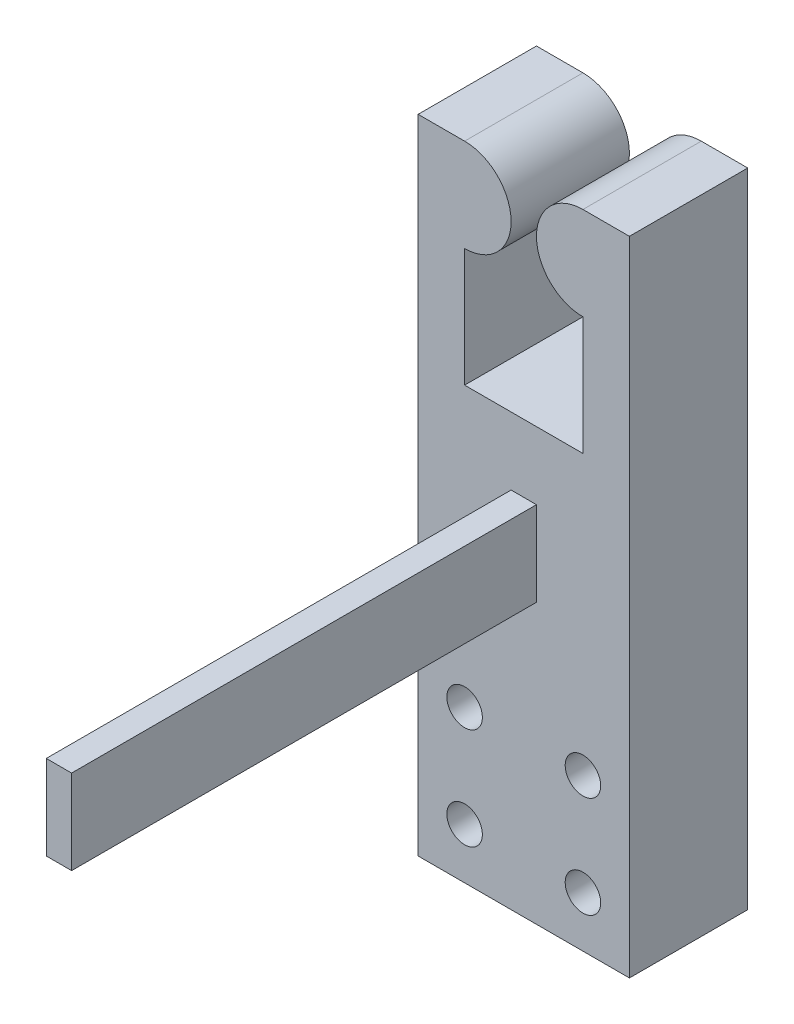
ISO-10303-21;
HEADER;
FILE_DESCRIPTION(('STEP AP214'),'2;1');
FILE_NAME('part.step','',(''),(''),'','','');
FILE_SCHEMA(('AUTOMOTIVE_DESIGN { 1 0 10303 214 1 1 1 1 }'));
ENDSEC;
DATA;
#1=APPLICATION_CONTEXT('core data for automotive mechanical design processes');
#2=APPLICATION_PROTOCOL_DEFINITION('international standard','automotive_design',2000,#1);
#3=PRODUCT_CONTEXT('',#1,'mechanical');
#4=PRODUCT('Part','Part','',(#3));
#5=PRODUCT_RELATED_PRODUCT_CATEGORY('part','',(#4));
#6=PRODUCT_DEFINITION_FORMATION('','',#4);
#7=PRODUCT_DEFINITION_CONTEXT('part definition',#1,'design');
#8=PRODUCT_DEFINITION('design','',#6,#7);
#9=PRODUCT_DEFINITION_SHAPE('','',#8);
#10=(LENGTH_UNIT() NAMED_UNIT(*) SI_UNIT(.MILLI.,.METRE.));
#11=(NAMED_UNIT(*) PLANE_ANGLE_UNIT() SI_UNIT($,.RADIAN.));
#12=(NAMED_UNIT(*) SI_UNIT($,.STERADIAN.) SOLID_ANGLE_UNIT());
#13=UNCERTAINTY_MEASURE_WITH_UNIT(LENGTH_MEASURE(1.E-05),#10,'distance_accuracy_value','');
#14=(GEOMETRIC_REPRESENTATION_CONTEXT(3) GLOBAL_UNCERTAINTY_ASSIGNED_CONTEXT((#13)) GLOBAL_UNIT_ASSIGNED_CONTEXT((#10,
#11,#12)) REPRESENTATION_CONTEXT('',''));
#15=CARTESIAN_POINT('',(0.,0.,0.));
#16=DIRECTION('',(0.,0.,1.));
#17=DIRECTION('',(1.,0.,0.));
#18=AXIS2_PLACEMENT_3D('',#15,#16,#17);
#19=CARTESIAN_POINT('',(-7.,-20.,0.));
#20=DIRECTION('',(0.,0.,1.));
#21=DIRECTION('',(1.,0.,0.));
#22=AXIS2_PLACEMENT_3D('',#19,#20,#21);
#23=CYLINDRICAL_SURFACE('',#22,2.1);
#24=CARTESIAN_POINT('',(-7.,-20.,14.));
#25=DIRECTION('',(0.,0.,1.));
#26=DIRECTION('',(1.,0.,0.));
#27=AXIS2_PLACEMENT_3D('',#24,#25,#26);
#28=CIRCLE('',#27,2.1);
#29=CARTESIAN_POINT('',(-4.9,-20.,14.));
#30=VERTEX_POINT('',#29);
#31=EDGE_CURVE('E201',#30,#30,#28,.T.);
#32=ORIENTED_EDGE('',*,*,#31,.T.);
#33=EDGE_LOOP('',(#32));
#34=FACE_BOUND('',#33,.T.);
#35=CARTESIAN_POINT('',(-7.,-20.,5.));
#36=DIRECTION('',(0.,0.,-1.));
#37=DIRECTION('',(-1.,0.,0.));
#38=AXIS2_PLACEMENT_3D('',#35,#36,#37);
#39=CIRCLE('',#38,2.1);
#40=CARTESIAN_POINT('',(-9.1,-20.,5.));
#41=VERTEX_POINT('',#40);
#42=EDGE_CURVE('E45',#41,#41,#39,.F.);
#43=ORIENTED_EDGE('',*,*,#42,.F.);
#44=EDGE_LOOP('',(#43));
#45=FACE_BOUND('',#44,.T.);
#46=ADVANCED_FACE('F41',(#34,#45),#23,.F.);
#47=CARTESIAN_POINT('',(-7.,-32.,0.));
#48=DIRECTION('',(0.,0.,1.));
#49=DIRECTION('',(1.,0.,0.));
#50=AXIS2_PLACEMENT_3D('',#47,#48,#49);
#51=CYLINDRICAL_SURFACE('',#50,2.1);
#52=CARTESIAN_POINT('',(-7.,-32.,14.));
#53=DIRECTION('',(0.,0.,1.));
#54=DIRECTION('',(1.,0.,0.));
#55=AXIS2_PLACEMENT_3D('',#52,#53,#54);
#56=CIRCLE('',#55,2.1);
#57=CARTESIAN_POINT('',(-4.9,-32.,14.));
#58=VERTEX_POINT('',#57);
#59=EDGE_CURVE('E198',#58,#58,#56,.T.);
#60=ORIENTED_EDGE('',*,*,#59,.T.);
#61=EDGE_LOOP('',(#60));
#62=FACE_BOUND('',#61,.T.);
#63=CARTESIAN_POINT('',(-7.,-32.,5.));
#64=DIRECTION('',(0.,0.,-1.));
#65=DIRECTION('',(-1.,0.,0.));
#66=AXIS2_PLACEMENT_3D('',#63,#64,#65);
#67=CIRCLE('',#66,2.1);
#68=CARTESIAN_POINT('',(-9.1,-32.,5.));
#69=VERTEX_POINT('',#68);
#70=EDGE_CURVE('E272',#69,#69,#67,.F.);
#71=ORIENTED_EDGE('',*,*,#70,.F.);
#72=EDGE_LOOP('',(#71));
#73=FACE_BOUND('',#72,.T.);
#74=ADVANCED_FACE('F282',(#62,#73),#51,.F.);
#75=CARTESIAN_POINT('',(7.,-32.,0.));
#76=DIRECTION('',(0.,0.,1.));
#77=DIRECTION('',(1.,0.,0.));
#78=AXIS2_PLACEMENT_3D('',#75,#76,#77);
#79=CYLINDRICAL_SURFACE('',#78,2.1);
#80=CARTESIAN_POINT('',(7.,-32.,14.));
#81=DIRECTION('',(0.,0.,1.));
#82=DIRECTION('',(-1.,0.,0.));
#83=AXIS2_PLACEMENT_3D('',#80,#81,#82);
#84=CIRCLE('',#83,2.1);
#85=CARTESIAN_POINT('',(4.9,-32.,14.));
#86=VERTEX_POINT('',#85);
#87=EDGE_CURVE('E202',#86,#86,#84,.T.);
#88=ORIENTED_EDGE('',*,*,#87,.T.);
#89=EDGE_LOOP('',(#88));
#90=FACE_BOUND('',#89,.T.);
#91=CARTESIAN_POINT('',(7.,-32.,5.));
#92=DIRECTION('',(0.,0.,-1.));
#93=DIRECTION('',(-1.,0.,0.));
#94=AXIS2_PLACEMENT_3D('',#91,#92,#93);
#95=CIRCLE('',#94,2.1);
#96=CARTESIAN_POINT('',(4.9,-32.,5.));
#97=VERTEX_POINT('',#96);
#98=EDGE_CURVE('E269',#97,#97,#95,.F.);
#99=ORIENTED_EDGE('',*,*,#98,.F.);
#100=EDGE_LOOP('',(#99));
#101=FACE_BOUND('',#100,.T.);
#102=ADVANCED_FACE('F289',(#90,#101),#79,.F.);
#103=CARTESIAN_POINT('',(7.,-20.,0.));
#104=DIRECTION('',(0.,0.,1.));
#105=DIRECTION('',(1.,0.,0.));
#106=AXIS2_PLACEMENT_3D('',#103,#104,#105);
#107=CYLINDRICAL_SURFACE('',#106,2.1);
#108=CARTESIAN_POINT('',(7.,-20.,14.));
#109=DIRECTION('',(0.,0.,1.));
#110=DIRECTION('',(-1.,0.,0.));
#111=AXIS2_PLACEMENT_3D('',#108,#109,#110);
#112=CIRCLE('',#111,2.1);
#113=CARTESIAN_POINT('',(4.9,-20.,14.));
#114=VERTEX_POINT('',#113);
#115=EDGE_CURVE('E189',#114,#114,#112,.T.);
#116=ORIENTED_EDGE('',*,*,#115,.T.);
#117=EDGE_LOOP('',(#116));
#118=FACE_BOUND('',#117,.T.);
#119=CARTESIAN_POINT('',(7.,-20.,5.));
#120=DIRECTION('',(0.,0.,-1.));
#121=DIRECTION('',(-1.,0.,0.));
#122=AXIS2_PLACEMENT_3D('',#119,#120,#121);
#123=CIRCLE('',#122,2.1);
#124=CARTESIAN_POINT('',(4.9,-20.,5.));
#125=VERTEX_POINT('',#124);
#126=EDGE_CURVE('E266',#125,#125,#123,.F.);
#127=ORIENTED_EDGE('',*,*,#126,.F.);
#128=EDGE_LOOP('',(#127));
#129=FACE_BOUND('',#128,.T.);
#130=ADVANCED_FACE('F294',(#118,#129),#107,.F.);
#131=CARTESIAN_POINT('',(12.5,38.,14.));
#132=DIRECTION('',(0.,-1.,0.));
#133=DIRECTION('',(0.,0.,-1.));
#134=AXIS2_PLACEMENT_3D('',#131,#132,#133);
#135=PLANE('',#134);
#136=DIRECTION('',(0.,0.,1.));
#137=VECTOR('',#136,1.);
#138=CARTESIAN_POINT('',(7.,38.,0.));
#139=LINE('',#138,#137);
#140=CARTESIAN_POINT('',(7.,38.,0.));
#141=VERTEX_POINT('',#140);
#142=CARTESIAN_POINT('',(7.,38.,14.));
#143=VERTEX_POINT('',#142);
#144=EDGE_CURVE('E192',#141,#143,#139,.T.);
#145=ORIENTED_EDGE('',*,*,#144,.T.);
#146=DIRECTION('',(-1.,0.,0.));
#147=VECTOR('',#146,1.);
#148=CARTESIAN_POINT('',(12.5,38.,14.));
#149=LINE('',#148,#147);
#150=CARTESIAN_POINT('',(12.5,38.,14.));
#151=VERTEX_POINT('',#150);
#152=EDGE_CURVE('E246',#151,#143,#149,.T.);
#153=ORIENTED_EDGE('',*,*,#152,.F.);
#154=DIRECTION('',(0.,0.,-1.));
#155=VECTOR('',#154,1.);
#156=CARTESIAN_POINT('',(12.5,38.,14.));
#157=LINE('',#156,#155);
#158=CARTESIAN_POINT('',(12.5,38.,0.));
#159=VERTEX_POINT('',#158);
#160=EDGE_CURVE('E261',#151,#159,#157,.T.);
#161=ORIENTED_EDGE('',*,*,#160,.T.);
#162=DIRECTION('',(-1.,0.,0.));
#163=VECTOR('',#162,1.);
#164=CARTESIAN_POINT('',(12.5,38.,0.));
#165=LINE('',#164,#163);
#166=EDGE_CURVE('E241',#159,#141,#165,.T.);
#167=ORIENTED_EDGE('',*,*,#166,.T.);
#168=EDGE_LOOP('',(#145,#153,#161,#167));
#169=FACE_BOUND('',#168,.T.);
#170=ADVANCED_FACE('F318',(#169),#135,.F.);
#171=CARTESIAN_POINT('',(0.,0.,14.));
#172=DIRECTION('',(0.,0.,1.));
#173=DIRECTION('',(1.,0.,0.));
#174=AXIS2_PLACEMENT_3D('',#171,#172,#173);
#175=PLANE('',#174);
#176=CARTESIAN_POINT('',(-7.,32.5,14.));
#177=DIRECTION('',(0.,0.,-1.));
#178=DIRECTION('',(1.,0.,0.));
#179=AXIS2_PLACEMENT_3D('',#176,#177,#178);
#180=CIRCLE('',#179,5.5);
#181=CARTESIAN_POINT('',(-7.,38.,14.));
#182=VERTEX_POINT('',#181);
#183=CARTESIAN_POINT('',(-7.,27.,14.));
#184=VERTEX_POINT('',#183);
#185=EDGE_CURVE('E166',#182,#184,#180,.T.);
#186=ORIENTED_EDGE('',*,*,#185,.F.);
#187=CARTESIAN_POINT('',(-12.5,38.,14.));
#188=VERTEX_POINT('',#187);
#189=EDGE_CURVE('E245',#182,#188,#149,.T.);
#190=ORIENTED_EDGE('',*,*,#189,.T.);
#191=DIRECTION('',(0.,-1.,0.));
#192=VECTOR('',#191,1.);
#193=CARTESIAN_POINT('',(-12.5,-38.,14.));
#194=LINE('',#193,#192);
#195=CARTESIAN_POINT('',(-12.5,-38.,14.));
#196=VERTEX_POINT('',#195);
#197=EDGE_CURVE('E237',#188,#196,#194,.T.);
#198=ORIENTED_EDGE('',*,*,#197,.T.);
#199=DIRECTION('',(1.,0.,0.));
#200=VECTOR('',#199,1.);
#201=CARTESIAN_POINT('',(12.5,-38.,14.));
#202=LINE('',#201,#200);
#203=CARTESIAN_POINT('',(12.5,-38.,14.));
#204=VERTEX_POINT('',#203);
#205=EDGE_CURVE('E240',#196,#204,#202,.T.);
#206=ORIENTED_EDGE('',*,*,#205,.T.);
#207=DIRECTION('',(0.,1.,0.));
#208=VECTOR('',#207,1.);
#209=CARTESIAN_POINT('',(12.5,-38.,14.));
#210=LINE('',#209,#208);
#211=EDGE_CURVE('E243',#204,#151,#210,.T.);
#212=ORIENTED_EDGE('',*,*,#211,.T.);
#213=ORIENTED_EDGE('',*,*,#152,.T.);
#214=CARTESIAN_POINT('',(7.,32.5,14.));
#215=DIRECTION('',(0.,0.,-1.));
#216=DIRECTION('',(-1.,0.,0.));
#217=AXIS2_PLACEMENT_3D('',#214,#215,#216);
#218=CIRCLE('',#217,5.5);
#219=CARTESIAN_POINT('',(7.,27.,14.));
#220=VERTEX_POINT('',#219);
#221=EDGE_CURVE('E169',#220,#143,#218,.T.);
#222=ORIENTED_EDGE('',*,*,#221,.F.);
#223=DIRECTION('',(0.,1.,0.));
#224=VECTOR('',#223,1.);
#225=CARTESIAN_POINT('',(7.,27.,14.));
#226=LINE('',#225,#224);
#227=CARTESIAN_POINT('',(7.,13.,14.));
#228=VERTEX_POINT('',#227);
#229=EDGE_CURVE('E183',#228,#220,#226,.T.);
#230=ORIENTED_EDGE('',*,*,#229,.F.);
#231=DIRECTION('',(1.,0.,0.));
#232=VECTOR('',#231,1.);
#233=CARTESIAN_POINT('',(-7.,13.,14.));
#234=LINE('',#233,#232);
#235=CARTESIAN_POINT('',(-7.,13.,14.));
#236=VERTEX_POINT('',#235);
#237=EDGE_CURVE('E181',#236,#228,#234,.T.);
#238=ORIENTED_EDGE('',*,*,#237,.F.);
#239=DIRECTION('',(0.,-1.,0.));
#240=VECTOR('',#239,1.);
#241=CARTESIAN_POINT('',(-7.,27.,14.));
#242=LINE('',#241,#240);
#243=EDGE_CURVE('E152',#184,#236,#242,.T.);
#244=ORIENTED_EDGE('',*,*,#243,.F.);
#245=EDGE_LOOP('',(#186,#190,#198,#206,#212,#213,#222,#230,#238,#244));
#246=FACE_BOUND('',#245,.T.);
#247=ORIENTED_EDGE('',*,*,#115,.F.);
#248=EDGE_LOOP('',(#247));
#249=FACE_BOUND('',#248,.T.);
#250=ORIENTED_EDGE('',*,*,#87,.F.);
#251=EDGE_LOOP('',(#250));
#252=FACE_BOUND('',#251,.T.);
#253=ORIENTED_EDGE('',*,*,#59,.F.);
#254=EDGE_LOOP('',(#253));
#255=FACE_BOUND('',#254,.T.);
#256=ORIENTED_EDGE('',*,*,#31,.F.);
#257=EDGE_LOOP('',(#256));
#258=FACE_BOUND('',#257,.T.);
#259=DIRECTION('',(-1.,0.,0.));
#260=VECTOR('',#259,1.);
#261=CARTESIAN_POINT('',(-1.5,5.,14.));
#262=LINE('',#261,#260);
#263=CARTESIAN_POINT('',(1.5,5.,14.));
#264=VERTEX_POINT('',#263);
#265=CARTESIAN_POINT('',(-1.5,5.,14.));
#266=VERTEX_POINT('',#265);
#267=EDGE_CURVE('E223',#264,#266,#262,.T.);
#268=ORIENTED_EDGE('',*,*,#267,.F.);
#269=DIRECTION('',(0.,1.,0.));
#270=VECTOR('',#269,1.);
#271=CARTESIAN_POINT('',(1.5,-5.,14.));
#272=LINE('',#271,#270);
#273=CARTESIAN_POINT('',(1.5,-5.,14.));
#274=VERTEX_POINT('',#273);
#275=EDGE_CURVE('E209',#274,#264,#272,.T.);
#276=ORIENTED_EDGE('',*,*,#275,.F.);
#277=DIRECTION('',(1.,0.,0.));
#278=VECTOR('',#277,1.);
#279=CARTESIAN_POINT('',(-1.5,-5.,14.));
#280=LINE('',#279,#278);
#281=CARTESIAN_POINT('',(-1.5,-5.,14.));
#282=VERTEX_POINT('',#281);
#283=EDGE_CURVE('E214',#282,#274,#280,.T.);
#284=ORIENTED_EDGE('',*,*,#283,.F.);
#285=DIRECTION('',(0.,-1.,0.));
#286=VECTOR('',#285,1.);
#287=CARTESIAN_POINT('',(-1.5,-5.,14.));
#288=LINE('',#287,#286);
#289=EDGE_CURVE('E225',#266,#282,#288,.T.);
#290=ORIENTED_EDGE('',*,*,#289,.F.);
#291=EDGE_LOOP('',(#268,#276,#284,#290));
#292=FACE_BOUND('',#291,.T.);
#293=ADVANCED_FACE('F315',(#246,#249,#252,#255,#258,#292),#175,.T.);
#294=CARTESIAN_POINT('',(-12.5,-38.,14.));
#295=DIRECTION('',(1.,0.,0.));
#296=DIRECTION('',(0.,0.,-1.));
#297=AXIS2_PLACEMENT_3D('',#294,#295,#296);
#298=PLANE('',#297);
#299=DIRECTION('',(0.,-1.,0.));
#300=VECTOR('',#299,1.);
#301=CARTESIAN_POINT('',(-12.5,-38.,0.));
#302=LINE('',#301,#300);
#303=CARTESIAN_POINT('',(-12.5,38.,0.));
#304=VERTEX_POINT('',#303);
#305=CARTESIAN_POINT('',(-12.5,-38.,0.));
#306=VERTEX_POINT('',#305);
#307=EDGE_CURVE('E236',#304,#306,#302,.T.);
#308=ORIENTED_EDGE('',*,*,#307,.T.);
#309=DIRECTION('',(0.,0.,-1.));
#310=VECTOR('',#309,1.);
#311=CARTESIAN_POINT('',(-12.5,-38.,14.));
#312=LINE('',#311,#310);
#313=EDGE_CURVE('E11',#196,#306,#312,.T.);
#314=ORIENTED_EDGE('',*,*,#313,.F.);
#315=ORIENTED_EDGE('',*,*,#197,.F.);
#316=DIRECTION('',(0.,0.,-1.));
#317=VECTOR('',#316,1.);
#318=CARTESIAN_POINT('',(-12.5,38.,14.));
#319=LINE('',#318,#317);
#320=EDGE_CURVE('E249',#188,#304,#319,.T.);
#321=ORIENTED_EDGE('',*,*,#320,.T.);
#322=EDGE_LOOP('',(#308,#314,#315,#321));
#323=FACE_BOUND('',#322,.T.);
#324=ADVANCED_FACE('F43',(#323),#298,.F.);
#325=CARTESIAN_POINT('',(12.5,-38.,14.));
#326=DIRECTION('',(0.,1.,0.));
#327=DIRECTION('',(0.,0.,1.));
#328=AXIS2_PLACEMENT_3D('',#325,#326,#327);
#329=PLANE('',#328);
#330=DIRECTION('',(1.,0.,0.));
#331=VECTOR('',#330,1.);
#332=CARTESIAN_POINT('',(12.5,-38.,0.));
#333=LINE('',#332,#331);
#334=CARTESIAN_POINT('',(12.5,-38.,0.));
#335=VERTEX_POINT('',#334);
#336=EDGE_CURVE('E252',#306,#335,#333,.T.);
#337=ORIENTED_EDGE('',*,*,#336,.T.);
#338=DIRECTION('',(0.,0.,-1.));
#339=VECTOR('',#338,1.);
#340=CARTESIAN_POINT('',(12.5,-38.,14.));
#341=LINE('',#340,#339);
#342=EDGE_CURVE('E50',#204,#335,#341,.T.);
#343=ORIENTED_EDGE('',*,*,#342,.F.);
#344=ORIENTED_EDGE('',*,*,#205,.F.);
#345=ORIENTED_EDGE('',*,*,#313,.T.);
#346=EDGE_LOOP('',(#337,#343,#344,#345));
#347=FACE_BOUND('',#346,.T.);
#348=ADVANCED_FACE('F329',(#347),#329,.F.);
#349=CARTESIAN_POINT('',(12.5,-38.,14.));
#350=DIRECTION('',(-1.,0.,0.));
#351=DIRECTION('',(0.,0.,1.));
#352=AXIS2_PLACEMENT_3D('',#349,#350,#351);
#353=PLANE('',#352);
#354=DIRECTION('',(0.,1.,0.));
#355=VECTOR('',#354,1.);
#356=CARTESIAN_POINT('',(12.5,-38.,0.));
#357=LINE('',#356,#355);
#358=EDGE_CURVE('E254',#335,#159,#357,.T.);
#359=ORIENTED_EDGE('',*,*,#358,.T.);
#360=ORIENTED_EDGE('',*,*,#160,.F.);
#361=ORIENTED_EDGE('',*,*,#211,.F.);
#362=ORIENTED_EDGE('',*,*,#342,.T.);
#363=EDGE_LOOP('',(#359,#360,#361,#362));
#364=FACE_BOUND('',#363,.T.);
#365=ADVANCED_FACE('F326',(#364),#353,.F.);
#366=ORIENTED_EDGE('',*,*,#189,.F.);
#367=DIRECTION('',(0.,0.,1.));
#368=VECTOR('',#367,1.);
#369=CARTESIAN_POINT('',(-7.,38.,0.));
#370=LINE('',#369,#368);
#371=CARTESIAN_POINT('',(-7.,38.,0.));
#372=VERTEX_POINT('',#371);
#373=EDGE_CURVE('E190',#372,#182,#370,.T.);
#374=ORIENTED_EDGE('',*,*,#373,.F.);
#375=EDGE_CURVE('E256',#372,#304,#165,.T.);
#376=ORIENTED_EDGE('',*,*,#375,.T.);
#377=ORIENTED_EDGE('',*,*,#320,.F.);
#378=EDGE_LOOP('',(#366,#374,#376,#377));
#379=FACE_BOUND('',#378,.T.);
#380=ADVANCED_FACE('F322',(#379),#135,.F.);
#381=CARTESIAN_POINT('',(0.,0.,0.));
#382=DIRECTION('',(0.,0.,1.));
#383=DIRECTION('',(1.,0.,0.));
#384=AXIS2_PLACEMENT_3D('',#381,#382,#383);
#385=PLANE('',#384);
#386=CARTESIAN_POINT('',(-7.,-32.,0.));
#387=DIRECTION('',(0.,0.,-1.));
#388=DIRECTION('',(-1.,0.,0.));
#389=AXIS2_PLACEMENT_3D('',#386,#387,#388);
#390=CIRCLE('',#389,3.);
#391=CARTESIAN_POINT('',(-10.,-32.,0.));
#392=VERTEX_POINT('',#391);
#393=EDGE_CURVE('E438',#392,#392,#390,.T.);
#394=ORIENTED_EDGE('',*,*,#393,.F.);
#395=EDGE_LOOP('',(#394));
#396=FACE_BOUND('',#395,.T.);
#397=CARTESIAN_POINT('',(7.,-32.,0.));
#398=DIRECTION('',(0.,0.,-1.));
#399=DIRECTION('',(-1.,0.,0.));
#400=AXIS2_PLACEMENT_3D('',#397,#398,#399);
#401=CIRCLE('',#400,3.);
#402=CARTESIAN_POINT('',(4.,-32.,0.));
#403=VERTEX_POINT('',#402);
#404=EDGE_CURVE('E432',#403,#403,#401,.T.);
#405=ORIENTED_EDGE('',*,*,#404,.F.);
#406=EDGE_LOOP('',(#405));
#407=FACE_BOUND('',#406,.T.);
#408=CARTESIAN_POINT('',(7.,-20.,0.));
#409=DIRECTION('',(0.,0.,-1.));
#410=DIRECTION('',(-1.,0.,0.));
#411=AXIS2_PLACEMENT_3D('',#408,#409,#410);
#412=CIRCLE('',#411,3.);
#413=CARTESIAN_POINT('',(4.,-20.,0.));
#414=VERTEX_POINT('',#413);
#415=EDGE_CURVE('E423',#414,#414,#412,.T.);
#416=ORIENTED_EDGE('',*,*,#415,.F.);
#417=EDGE_LOOP('',(#416));
#418=FACE_BOUND('',#417,.T.);
#419=CARTESIAN_POINT('',(-7.,-20.,0.));
#420=DIRECTION('',(0.,0.,-1.));
#421=DIRECTION('',(-1.,0.,0.));
#422=AXIS2_PLACEMENT_3D('',#419,#420,#421);
#423=CIRCLE('',#422,3.);
#424=CARTESIAN_POINT('',(-10.,-20.,0.));
#425=VERTEX_POINT('',#424);
#426=EDGE_CURVE('E172',#425,#425,#423,.T.);
#427=ORIENTED_EDGE('',*,*,#426,.F.);
#428=EDGE_LOOP('',(#427));
#429=FACE_BOUND('',#428,.T.);
#430=ORIENTED_EDGE('',*,*,#375,.F.);
#431=CARTESIAN_POINT('',(-7.,32.5,0.));
#432=DIRECTION('',(0.,0.,-1.));
#433=DIRECTION('',(1.,0.,0.));
#434=AXIS2_PLACEMENT_3D('',#431,#432,#433);
#435=CIRCLE('',#434,5.5);
#436=CARTESIAN_POINT('',(-7.,27.,0.));
#437=VERTEX_POINT('',#436);
#438=EDGE_CURVE('E157',#372,#437,#435,.T.);
#439=ORIENTED_EDGE('',*,*,#438,.T.);
#440=DIRECTION('',(0.,-1.,0.));
#441=VECTOR('',#440,1.);
#442=CARTESIAN_POINT('',(-7.,27.,0.));
#443=LINE('',#442,#441);
#444=CARTESIAN_POINT('',(-7.,13.,0.));
#445=VERTEX_POINT('',#444);
#446=EDGE_CURVE('E149',#437,#445,#443,.T.);
#447=ORIENTED_EDGE('',*,*,#446,.T.);
#448=DIRECTION('',(1.,0.,0.));
#449=VECTOR('',#448,1.);
#450=CARTESIAN_POINT('',(-7.,13.,0.));
#451=LINE('',#450,#449);
#452=CARTESIAN_POINT('',(7.,13.,0.));
#453=VERTEX_POINT('',#452);
#454=EDGE_CURVE('E160',#445,#453,#451,.T.);
#455=ORIENTED_EDGE('',*,*,#454,.T.);
#456=DIRECTION('',(0.,1.,0.));
#457=VECTOR('',#456,1.);
#458=CARTESIAN_POINT('',(7.,27.,0.));
#459=LINE('',#458,#457);
#460=CARTESIAN_POINT('',(7.,27.,0.));
#461=VERTEX_POINT('',#460);
#462=EDGE_CURVE('E58',#453,#461,#459,.T.);
#463=ORIENTED_EDGE('',*,*,#462,.T.);
#464=CARTESIAN_POINT('',(7.,32.5,0.));
#465=DIRECTION('',(0.,0.,-1.));
#466=DIRECTION('',(-1.,0.,0.));
#467=AXIS2_PLACEMENT_3D('',#464,#465,#466);
#468=CIRCLE('',#467,5.5);
#469=EDGE_CURVE('E176',#461,#141,#468,.T.);
#470=ORIENTED_EDGE('',*,*,#469,.T.);
#471=ORIENTED_EDGE('',*,*,#166,.F.);
#472=ORIENTED_EDGE('',*,*,#358,.F.);
#473=ORIENTED_EDGE('',*,*,#336,.F.);
#474=ORIENTED_EDGE('',*,*,#307,.F.);
#475=EDGE_LOOP('',(#430,#439,#447,#455,#463,#470,#471,#472,#473,#474));
#476=FACE_BOUND('',#475,.T.);
#477=ADVANCED_FACE('F165',(#396,#407,#418,#429,#476),#385,.F.);
#478=CARTESIAN_POINT('',(1.5,-5.,69.));
#479=DIRECTION('',(-1.,0.,0.));
#480=DIRECTION('',(0.,0.,1.));
#481=AXIS2_PLACEMENT_3D('',#478,#479,#480);
#482=PLANE('',#481);
#483=ORIENTED_EDGE('',*,*,#275,.T.);
#484=DIRECTION('',(0.,0.,-1.));
#485=VECTOR('',#484,1.);
#486=CARTESIAN_POINT('',(1.5,5.,69.));
#487=LINE('',#486,#485);
#488=CARTESIAN_POINT('',(1.5,5.,69.));
#489=VERTEX_POINT('',#488);
#490=EDGE_CURVE('E234',#489,#264,#487,.T.);
#491=ORIENTED_EDGE('',*,*,#490,.F.);
#492=DIRECTION('',(0.,1.,0.));
#493=VECTOR('',#492,1.);
#494=CARTESIAN_POINT('',(1.5,-5.,69.));
#495=LINE('',#494,#493);
#496=CARTESIAN_POINT('',(1.5,-5.,69.));
#497=VERTEX_POINT('',#496);
#498=EDGE_CURVE('E210',#497,#489,#495,.T.);
#499=ORIENTED_EDGE('',*,*,#498,.F.);
#500=DIRECTION('',(0.,0.,-1.));
#501=VECTOR('',#500,1.);
#502=CARTESIAN_POINT('',(1.5,-5.,69.));
#503=LINE('',#502,#501);
#504=EDGE_CURVE('E220',#497,#274,#503,.T.);
#505=ORIENTED_EDGE('',*,*,#504,.T.);
#506=EDGE_LOOP('',(#483,#491,#499,#505));
#507=FACE_BOUND('',#506,.T.);
#508=ADVANCED_FACE('F310',(#507),#482,.F.);
#509=CARTESIAN_POINT('',(-1.5,5.,69.));
#510=DIRECTION('',(0.,-1.,0.));
#511=DIRECTION('',(0.,0.,-1.));
#512=AXIS2_PLACEMENT_3D('',#509,#510,#511);
#513=PLANE('',#512);
#514=ORIENTED_EDGE('',*,*,#267,.T.);
#515=DIRECTION('',(0.,0.,-1.));
#516=VECTOR('',#515,1.);
#517=CARTESIAN_POINT('',(-1.5,5.,69.));
#518=LINE('',#517,#516);
#519=CARTESIAN_POINT('',(-1.5,5.,69.));
#520=VERTEX_POINT('',#519);
#521=EDGE_CURVE('E231',#520,#266,#518,.T.);
#522=ORIENTED_EDGE('',*,*,#521,.F.);
#523=DIRECTION('',(-1.,0.,0.));
#524=VECTOR('',#523,1.);
#525=CARTESIAN_POINT('',(-1.5,5.,69.));
#526=LINE('',#525,#524);
#527=EDGE_CURVE('E213',#489,#520,#526,.T.);
#528=ORIENTED_EDGE('',*,*,#527,.F.);
#529=ORIENTED_EDGE('',*,*,#490,.T.);
#530=EDGE_LOOP('',(#514,#522,#528,#529));
#531=FACE_BOUND('',#530,.T.);
#532=ADVANCED_FACE('F306',(#531),#513,.F.);
#533=CARTESIAN_POINT('',(-1.5,-5.,69.));
#534=DIRECTION('',(1.,0.,0.));
#535=DIRECTION('',(0.,0.,-1.));
#536=AXIS2_PLACEMENT_3D('',#533,#534,#535);
#537=PLANE('',#536);
#538=ORIENTED_EDGE('',*,*,#289,.T.);
#539=DIRECTION('',(0.,0.,-1.));
#540=VECTOR('',#539,1.);
#541=CARTESIAN_POINT('',(-1.5,-5.,69.));
#542=LINE('',#541,#540);
#543=CARTESIAN_POINT('',(-1.5,-5.,69.));
#544=VERTEX_POINT('',#543);
#545=EDGE_CURVE('E66',#544,#282,#542,.T.);
#546=ORIENTED_EDGE('',*,*,#545,.F.);
#547=DIRECTION('',(0.,-1.,0.));
#548=VECTOR('',#547,1.);
#549=CARTESIAN_POINT('',(-1.5,-5.,69.));
#550=LINE('',#549,#548);
#551=EDGE_CURVE('E216',#520,#544,#550,.T.);
#552=ORIENTED_EDGE('',*,*,#551,.F.);
#553=ORIENTED_EDGE('',*,*,#521,.T.);
#554=EDGE_LOOP('',(#538,#546,#552,#553));
#555=FACE_BOUND('',#554,.T.);
#556=ADVANCED_FACE('F303',(#555),#537,.F.);
#557=CARTESIAN_POINT('',(-1.5,-5.,69.));
#558=DIRECTION('',(0.,1.,0.));
#559=DIRECTION('',(0.,0.,1.));
#560=AXIS2_PLACEMENT_3D('',#557,#558,#559);
#561=PLANE('',#560);
#562=ORIENTED_EDGE('',*,*,#283,.T.);
#563=ORIENTED_EDGE('',*,*,#504,.F.);
#564=DIRECTION('',(1.,0.,0.));
#565=VECTOR('',#564,1.);
#566=CARTESIAN_POINT('',(-1.5,-5.,69.));
#567=LINE('',#566,#565);
#568=EDGE_CURVE('E218',#544,#497,#567,.T.);
#569=ORIENTED_EDGE('',*,*,#568,.F.);
#570=ORIENTED_EDGE('',*,*,#545,.T.);
#571=EDGE_LOOP('',(#562,#563,#569,#570));
#572=FACE_BOUND('',#571,.T.);
#573=ADVANCED_FACE('F299',(#572),#561,.F.);
#574=CARTESIAN_POINT('',(0.,0.,69.));
#575=DIRECTION('',(0.,0.,-1.));
#576=DIRECTION('',(-1.,0.,0.));
#577=AXIS2_PLACEMENT_3D('',#574,#575,#576);
#578=PLANE('',#577);
#579=ORIENTED_EDGE('',*,*,#498,.T.);
#580=ORIENTED_EDGE('',*,*,#527,.T.);
#581=ORIENTED_EDGE('',*,*,#551,.T.);
#582=ORIENTED_EDGE('',*,*,#568,.T.);
#583=EDGE_LOOP('',(#579,#580,#581,#582));
#584=FACE_BOUND('',#583,.T.);
#585=ADVANCED_FACE('F296',(#584),#578,.F.);
#586=CARTESIAN_POINT('',(-7.,27.,0.));
#587=DIRECTION('',(-1.,0.,0.));
#588=DIRECTION('',(0.,-1.,0.));
#589=AXIS2_PLACEMENT_3D('',#586,#587,#588);
#590=PLANE('',#589);
#591=ORIENTED_EDGE('',*,*,#243,.T.);
#592=DIRECTION('',(0.,0.,1.));
#593=VECTOR('',#592,1.);
#594=CARTESIAN_POINT('',(-7.,13.,0.));
#595=LINE('',#594,#593);
#596=EDGE_CURVE('E145',#445,#236,#595,.T.);
#597=ORIENTED_EDGE('',*,*,#596,.F.);
#598=ORIENTED_EDGE('',*,*,#446,.F.);
#599=DIRECTION('',(0.,0.,1.));
#600=VECTOR('',#599,1.);
#601=CARTESIAN_POINT('',(-7.,27.,0.));
#602=LINE('',#601,#600);
#603=EDGE_CURVE('E187',#437,#184,#602,.T.);
#604=ORIENTED_EDGE('',*,*,#603,.T.);
#605=EDGE_LOOP('',(#591,#597,#598,#604));
#606=FACE_BOUND('',#605,.T.);
#607=ADVANCED_FACE('F147',(#606),#590,.F.);
#608=CARTESIAN_POINT('',(-7.,32.5,0.));
#609=DIRECTION('',(0.,0.,1.));
#610=DIRECTION('',(1.,0.,0.));
#611=AXIS2_PLACEMENT_3D('',#608,#609,#610);
#612=CYLINDRICAL_SURFACE('',#611,5.5);
#613=ORIENTED_EDGE('',*,*,#185,.T.);
#614=ORIENTED_EDGE('',*,*,#603,.F.);
#615=ORIENTED_EDGE('',*,*,#438,.F.);
#616=ORIENTED_EDGE('',*,*,#373,.T.);
#617=EDGE_LOOP('',(#613,#614,#615,#616));
#618=FACE_BOUND('',#617,.T.);
#619=ADVANCED_FACE('F356',(#618),#612,.T.);
#620=CARTESIAN_POINT('',(7.,32.5,0.));
#621=DIRECTION('',(0.,0.,1.));
#622=DIRECTION('',(1.,0.,0.));
#623=AXIS2_PLACEMENT_3D('',#620,#621,#622);
#624=CYLINDRICAL_SURFACE('',#623,5.5);
#625=ORIENTED_EDGE('',*,*,#221,.T.);
#626=ORIENTED_EDGE('',*,*,#144,.F.);
#627=ORIENTED_EDGE('',*,*,#469,.F.);
#628=DIRECTION('',(0.,0.,1.));
#629=VECTOR('',#628,1.);
#630=CARTESIAN_POINT('',(7.,27.,0.));
#631=LINE('',#630,#629);
#632=EDGE_CURVE('E195',#461,#220,#631,.T.);
#633=ORIENTED_EDGE('',*,*,#632,.T.);
#634=EDGE_LOOP('',(#625,#626,#627,#633));
#635=FACE_BOUND('',#634,.T.);
#636=ADVANCED_FACE('F359',(#635),#624,.T.);
#637=CARTESIAN_POINT('',(7.,27.,0.));
#638=DIRECTION('',(1.,0.,0.));
#639=DIRECTION('',(0.,1.,0.));
#640=AXIS2_PLACEMENT_3D('',#637,#638,#639);
#641=PLANE('',#640);
#642=ORIENTED_EDGE('',*,*,#229,.T.);
#643=ORIENTED_EDGE('',*,*,#632,.F.);
#644=ORIENTED_EDGE('',*,*,#462,.F.);
#645=DIRECTION('',(0.,0.,1.));
#646=VECTOR('',#645,1.);
#647=CARTESIAN_POINT('',(7.,13.,0.));
#648=LINE('',#647,#646);
#649=EDGE_CURVE('E156',#453,#228,#648,.T.);
#650=ORIENTED_EDGE('',*,*,#649,.T.);
#651=EDGE_LOOP('',(#642,#643,#644,#650));
#652=FACE_BOUND('',#651,.T.);
#653=ADVANCED_FACE('F357',(#652),#641,.F.);
#654=CARTESIAN_POINT('',(-7.,13.,0.));
#655=DIRECTION('',(0.,-1.,0.));
#656=DIRECTION('',(0.,0.,-1.));
#657=AXIS2_PLACEMENT_3D('',#654,#655,#656);
#658=PLANE('',#657);
#659=ORIENTED_EDGE('',*,*,#237,.T.);
#660=ORIENTED_EDGE('',*,*,#649,.F.);
#661=ORIENTED_EDGE('',*,*,#454,.F.);
#662=ORIENTED_EDGE('',*,*,#596,.T.);
#663=EDGE_LOOP('',(#659,#660,#661,#662));
#664=FACE_BOUND('',#663,.T.);
#665=ADVANCED_FACE('F161',(#664),#658,.F.);
#666=CARTESIAN_POINT('',(7.,-20.,5.));
#667=DIRECTION('',(0.,0.,-1.));
#668=DIRECTION('',(-1.,0.,0.));
#669=AXIS2_PLACEMENT_3D('',#666,#667,#668);
#670=PLANE('',#669);
#671=CARTESIAN_POINT('',(7.,-20.,5.));
#672=DIRECTION('',(0.,0.,-1.));
#673=DIRECTION('',(-1.,0.,0.));
#674=AXIS2_PLACEMENT_3D('',#671,#672,#673);
#675=CIRCLE('',#674,3.);
#676=CARTESIAN_POINT('',(4.,-20.,5.));
#677=VERTEX_POINT('',#676);
#678=EDGE_CURVE('E421',#677,#677,#675,.T.);
#679=ORIENTED_EDGE('',*,*,#678,.T.);
#680=EDGE_LOOP('',(#679));
#681=FACE_BOUND('',#680,.T.);
#682=ORIENTED_EDGE('',*,*,#126,.T.);
#683=EDGE_LOOP('',(#682));
#684=FACE_BOUND('',#683,.T.);
#685=ADVANCED_FACE('F371',(#681,#684),#670,.T.);
#686=CARTESIAN_POINT('',(7.,-20.,5.));
#687=DIRECTION('',(0.,0.,-1.));
#688=DIRECTION('',(-1.,0.,0.));
#689=AXIS2_PLACEMENT_3D('',#686,#687,#688);
#690=CYLINDRICAL_SURFACE('',#689,3.);
#691=ORIENTED_EDGE('',*,*,#678,.F.);
#692=EDGE_LOOP('',(#691));
#693=FACE_BOUND('',#692,.T.);
#694=ORIENTED_EDGE('',*,*,#415,.T.);
#695=EDGE_LOOP('',(#694));
#696=FACE_BOUND('',#695,.T.);
#697=ADVANCED_FACE('F386',(#693,#696),#690,.F.);
#698=CARTESIAN_POINT('',(7.,-32.,5.));
#699=DIRECTION('',(0.,0.,-1.));
#700=DIRECTION('',(-1.,0.,0.));
#701=AXIS2_PLACEMENT_3D('',#698,#699,#700);
#702=PLANE('',#701);
#703=CARTESIAN_POINT('',(7.,-32.,5.));
#704=DIRECTION('',(0.,0.,-1.));
#705=DIRECTION('',(-1.,0.,0.));
#706=AXIS2_PLACEMENT_3D('',#703,#704,#705);
#707=CIRCLE('',#706,3.);
#708=CARTESIAN_POINT('',(4.,-32.,5.));
#709=VERTEX_POINT('',#708);
#710=EDGE_CURVE('E428',#709,#709,#707,.T.);
#711=ORIENTED_EDGE('',*,*,#710,.T.);
#712=EDGE_LOOP('',(#711));
#713=FACE_BOUND('',#712,.T.);
#714=ORIENTED_EDGE('',*,*,#98,.T.);
#715=EDGE_LOOP('',(#714));
#716=FACE_BOUND('',#715,.T.);
#717=ADVANCED_FACE('F383',(#713,#716),#702,.T.);
#718=CARTESIAN_POINT('',(7.,-32.,5.));
#719=DIRECTION('',(0.,0.,-1.));
#720=DIRECTION('',(-1.,0.,0.));
#721=AXIS2_PLACEMENT_3D('',#718,#719,#720);
#722=CYLINDRICAL_SURFACE('',#721,3.);
#723=ORIENTED_EDGE('',*,*,#710,.F.);
#724=EDGE_LOOP('',(#723));
#725=FACE_BOUND('',#724,.T.);
#726=ORIENTED_EDGE('',*,*,#404,.T.);
#727=EDGE_LOOP('',(#726));
#728=FACE_BOUND('',#727,.T.);
#729=ADVANCED_FACE('F385',(#725,#728),#722,.F.);
#730=CARTESIAN_POINT('',(-7.,-32.,5.));
#731=DIRECTION('',(0.,0.,-1.));
#732=DIRECTION('',(-1.,0.,0.));
#733=AXIS2_PLACEMENT_3D('',#730,#731,#732);
#734=PLANE('',#733);
#735=CARTESIAN_POINT('',(-7.,-32.,5.));
#736=DIRECTION('',(0.,0.,-1.));
#737=DIRECTION('',(-1.,0.,0.));
#738=AXIS2_PLACEMENT_3D('',#735,#736,#737);
#739=CIRCLE('',#738,3.);
#740=CARTESIAN_POINT('',(-10.,-32.,5.));
#741=VERTEX_POINT('',#740);
#742=EDGE_CURVE('E435',#741,#741,#739,.T.);
#743=ORIENTED_EDGE('',*,*,#742,.T.);
#744=EDGE_LOOP('',(#743));
#745=FACE_BOUND('',#744,.T.);
#746=ORIENTED_EDGE('',*,*,#70,.T.);
#747=EDGE_LOOP('',(#746));
#748=FACE_BOUND('',#747,.T.);
#749=ADVANCED_FACE('F393',(#745,#748),#734,.T.);
#750=CARTESIAN_POINT('',(-7.,-32.,5.));
#751=DIRECTION('',(0.,0.,-1.));
#752=DIRECTION('',(-1.,0.,0.));
#753=AXIS2_PLACEMENT_3D('',#750,#751,#752);
#754=CYLINDRICAL_SURFACE('',#753,3.);
#755=ORIENTED_EDGE('',*,*,#742,.F.);
#756=EDGE_LOOP('',(#755));
#757=FACE_BOUND('',#756,.T.);
#758=ORIENTED_EDGE('',*,*,#393,.T.);
#759=EDGE_LOOP('',(#758));
#760=FACE_BOUND('',#759,.T.);
#761=ADVANCED_FACE('F403',(#757,#760),#754,.F.);
#762=CARTESIAN_POINT('',(-7.,-20.,5.));
#763=DIRECTION('',(0.,0.,-1.));
#764=DIRECTION('',(-1.,0.,0.));
#765=AXIS2_PLACEMENT_3D('',#762,#763,#764);
#766=PLANE('',#765);
#767=CARTESIAN_POINT('',(-7.,-20.,5.));
#768=DIRECTION('',(0.,0.,-1.));
#769=DIRECTION('',(-1.,0.,0.));
#770=AXIS2_PLACEMENT_3D('',#767,#768,#769);
#771=CIRCLE('',#770,3.);
#772=CARTESIAN_POINT('',(-10.,-20.,5.));
#773=VERTEX_POINT('',#772);
#774=EDGE_CURVE('E270',#773,#773,#771,.T.);
#775=ORIENTED_EDGE('',*,*,#774,.T.);
#776=EDGE_LOOP('',(#775));
#777=FACE_BOUND('',#776,.T.);
#778=ORIENTED_EDGE('',*,*,#42,.T.);
#779=EDGE_LOOP('',(#778));
#780=FACE_BOUND('',#779,.T.);
#781=ADVANCED_FACE('F279',(#777,#780),#766,.T.);
#782=CARTESIAN_POINT('',(-7.,-20.,5.));
#783=DIRECTION('',(0.,0.,-1.));
#784=DIRECTION('',(-1.,0.,0.));
#785=AXIS2_PLACEMENT_3D('',#782,#783,#784);
#786=CYLINDRICAL_SURFACE('',#785,3.);
#787=ORIENTED_EDGE('',*,*,#774,.F.);
#788=EDGE_LOOP('',(#787));
#789=FACE_BOUND('',#788,.T.);
#790=ORIENTED_EDGE('',*,*,#426,.T.);
#791=EDGE_LOOP('',(#790));
#792=FACE_BOUND('',#791,.T.);
#793=ADVANCED_FACE('F409',(#789,#792),#786,.F.);
#794=CLOSED_SHELL('',(#46,#74,#102,#130,#170,#293,#324,#348,#365,#380,#477,#508,#532,#556,#573,
#585,#607,#619,#636,#653,#665,#685,#697,#717,#729,#749,#761,#781,#793));
#795=MANIFOLD_SOLID_BREP('B2',#794);
#796=ADVANCED_BREP_SHAPE_REPRESENTATION('',(#18,#795),#14);
#797=SHAPE_DEFINITION_REPRESENTATION(#9,#796);
ENDSEC;
END-ISO-10303-21;
